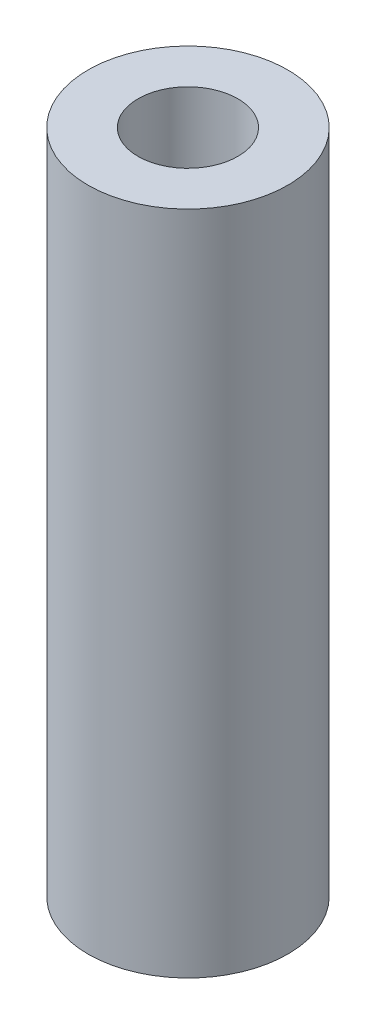
ISO-10303-21;
HEADER;
FILE_DESCRIPTION(('STEP AP214'),'2;1');
FILE_NAME('part.step','',(''),(''),'','','');
FILE_SCHEMA(('AUTOMOTIVE_DESIGN { 1 0 10303 214 1 1 1 1 }'));
ENDSEC;
DATA;
#1=APPLICATION_CONTEXT('core data for automotive mechanical design processes');
#2=APPLICATION_PROTOCOL_DEFINITION('international standard','automotive_design',2000,#1);
#3=PRODUCT_CONTEXT('',#1,'mechanical');
#4=PRODUCT('Part','Part','',(#3));
#5=PRODUCT_RELATED_PRODUCT_CATEGORY('part','',(#4));
#6=PRODUCT_DEFINITION_FORMATION('','',#4);
#7=PRODUCT_DEFINITION_CONTEXT('part definition',#1,'design');
#8=PRODUCT_DEFINITION('design','',#6,#7);
#9=PRODUCT_DEFINITION_SHAPE('','',#8);
#10=(LENGTH_UNIT() NAMED_UNIT(*) SI_UNIT(.MILLI.,.METRE.));
#11=(NAMED_UNIT(*) PLANE_ANGLE_UNIT() SI_UNIT($,.RADIAN.));
#12=(NAMED_UNIT(*) SI_UNIT($,.STERADIAN.) SOLID_ANGLE_UNIT());
#13=UNCERTAINTY_MEASURE_WITH_UNIT(LENGTH_MEASURE(1.E-05),#10,'distance_accuracy_value','');
#14=(GEOMETRIC_REPRESENTATION_CONTEXT(3) GLOBAL_UNCERTAINTY_ASSIGNED_CONTEXT((#13)) GLOBAL_UNIT_ASSIGNED_CONTEXT((#10,
#11,#12)) REPRESENTATION_CONTEXT('',''));
#15=CARTESIAN_POINT('',(0.,0.,0.));
#16=DIRECTION('',(0.,0.,1.));
#17=DIRECTION('',(1.,0.,0.));
#18=AXIS2_PLACEMENT_3D('',#15,#16,#17);
#19=CARTESIAN_POINT('',(0.,20.,0.));
#20=DIRECTION('',(0.,1.,0.));
#21=DIRECTION('',(0.,0.,1.));
#22=AXIS2_PLACEMENT_3D('',#19,#20,#21);
#23=PLANE('',#22);
#24=CARTESIAN_POINT('',(0.,20.,0.));
#25=DIRECTION('',(0.,1.,0.));
#26=DIRECTION('',(0.,0.,1.));
#27=AXIS2_PLACEMENT_3D('',#24,#25,#26);
#28=CIRCLE('',#27,3.);
#29=CARTESIAN_POINT('',(0.,20.,3.));
#30=VERTEX_POINT('',#29);
#31=EDGE_CURVE('E10',#30,#30,#28,.T.);
#32=ORIENTED_EDGE('',*,*,#31,.T.);
#33=EDGE_LOOP('',(#32));
#34=FACE_BOUND('',#33,.T.);
#35=CARTESIAN_POINT('',(0.,20.,0.));
#36=DIRECTION('',(0.,1.,0.));
#37=DIRECTION('',(0.,0.,1.));
#38=AXIS2_PLACEMENT_3D('',#35,#36,#37);
#39=CIRCLE('',#38,1.5);
#40=CARTESIAN_POINT('',(0.,20.,1.5));
#41=VERTEX_POINT('',#40);
#42=EDGE_CURVE('E56',#41,#41,#39,.T.);
#43=ORIENTED_EDGE('',*,*,#42,.F.);
#44=EDGE_LOOP('',(#43));
#45=FACE_BOUND('',#44,.T.);
#46=ADVANCED_FACE('F43',(#34,#45),#23,.T.);
#47=CARTESIAN_POINT('',(0.,0.,0.));
#48=DIRECTION('',(0.,1.,0.));
#49=DIRECTION('',(0.,0.,1.));
#50=AXIS2_PLACEMENT_3D('',#47,#48,#49);
#51=PLANE('',#50);
#52=CARTESIAN_POINT('',(0.,0.,0.));
#53=DIRECTION('',(0.,1.,0.));
#54=DIRECTION('',(0.,0.,1.));
#55=AXIS2_PLACEMENT_3D('',#52,#53,#54);
#56=CIRCLE('',#55,3.);
#57=CARTESIAN_POINT('',(0.,0.,3.));
#58=VERTEX_POINT('',#57);
#59=EDGE_CURVE('E47',#58,#58,#56,.T.);
#60=ORIENTED_EDGE('',*,*,#59,.F.);
#61=EDGE_LOOP('',(#60));
#62=FACE_BOUND('',#61,.T.);
#63=CARTESIAN_POINT('',(0.,0.,0.));
#64=DIRECTION('',(0.,1.,0.));
#65=DIRECTION('',(0.,0.,1.));
#66=AXIS2_PLACEMENT_3D('',#63,#64,#65);
#67=CIRCLE('',#66,1.5);
#68=CARTESIAN_POINT('',(0.,0.,1.5));
#69=VERTEX_POINT('',#68);
#70=EDGE_CURVE('E58',#69,#69,#67,.T.);
#71=ORIENTED_EDGE('',*,*,#70,.T.);
#72=EDGE_LOOP('',(#71));
#73=FACE_BOUND('',#72,.T.);
#74=ADVANCED_FACE('F70',(#62,#73),#51,.F.);
#75=CARTESIAN_POINT('',(0.,20.,0.));
#76=DIRECTION('',(0.,-1.,0.));
#77=DIRECTION('',(0.,0.,-1.));
#78=AXIS2_PLACEMENT_3D('',#75,#76,#77);
#79=CYLINDRICAL_SURFACE('',#78,3.);
#80=ORIENTED_EDGE('',*,*,#31,.F.);
#81=EDGE_LOOP('',(#80));
#82=FACE_BOUND('',#81,.T.);
#83=ORIENTED_EDGE('',*,*,#59,.T.);
#84=EDGE_LOOP('',(#83));
#85=FACE_BOUND('',#84,.T.);
#86=ADVANCED_FACE('F45',(#82,#85),#79,.T.);
#87=CARTESIAN_POINT('',(0.,20.,0.));
#88=DIRECTION('',(0.,-1.,0.));
#89=DIRECTION('',(0.,0.,-1.));
#90=AXIS2_PLACEMENT_3D('',#87,#88,#89);
#91=CYLINDRICAL_SURFACE('',#90,1.5);
#92=ORIENTED_EDGE('',*,*,#42,.T.);
#93=EDGE_LOOP('',(#92));
#94=FACE_BOUND('',#93,.T.);
#95=ORIENTED_EDGE('',*,*,#70,.F.);
#96=EDGE_LOOP('',(#95));
#97=FACE_BOUND('',#96,.T.);
#98=ADVANCED_FACE('F66',(#94,#97),#91,.F.);
#99=CLOSED_SHELL('',(#46,#74,#86,#98));
#100=MANIFOLD_SOLID_BREP('B2',#99);
#101=ADVANCED_BREP_SHAPE_REPRESENTATION('',(#18,#100),#14);
#102=SHAPE_DEFINITION_REPRESENTATION(#9,#101);
ENDSEC;
END-ISO-10303-21;
